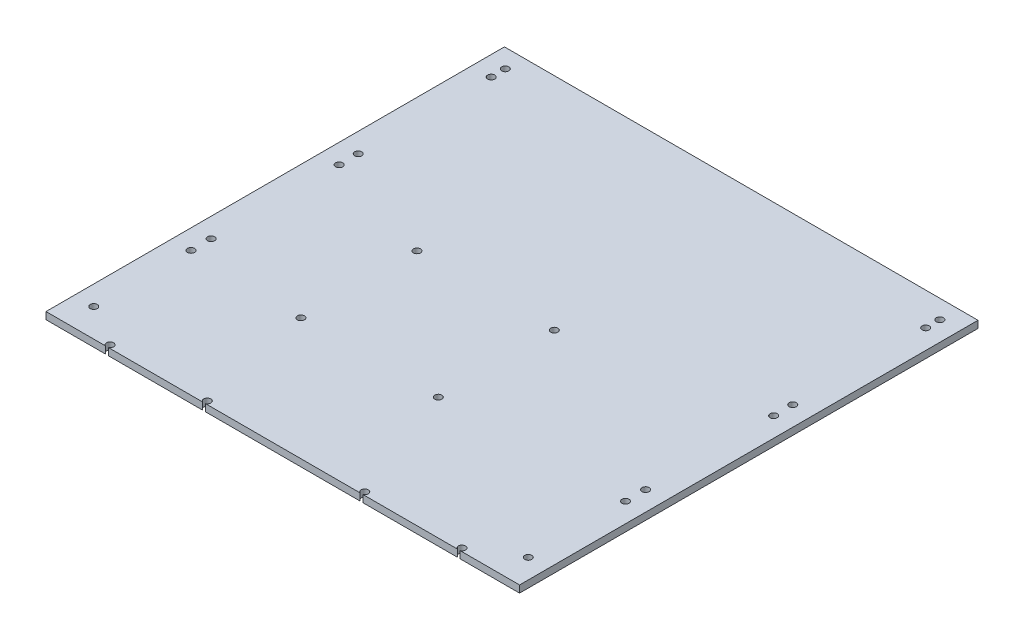
ISO-10303-21;
HEADER;
FILE_DESCRIPTION(('STEP AP214'),'2;1');
FILE_NAME('part.step','',(''),(''),'','','');
FILE_SCHEMA(('AUTOMOTIVE_DESIGN { 1 0 10303 214 1 1 1 1 }'));
ENDSEC;
DATA;
#1=APPLICATION_CONTEXT('core data for automotive mechanical design processes');
#2=APPLICATION_PROTOCOL_DEFINITION('international standard','automotive_design',2000,#1);
#3=PRODUCT_CONTEXT('',#1,'mechanical');
#4=PRODUCT('Part','Part','',(#3));
#5=PRODUCT_RELATED_PRODUCT_CATEGORY('part','',(#4));
#6=PRODUCT_DEFINITION_FORMATION('','',#4);
#7=PRODUCT_DEFINITION_CONTEXT('part definition',#1,'design');
#8=PRODUCT_DEFINITION('design','',#6,#7);
#9=PRODUCT_DEFINITION_SHAPE('','',#8);
#10=(LENGTH_UNIT() NAMED_UNIT(*) SI_UNIT(.MILLI.,.METRE.));
#11=(NAMED_UNIT(*) PLANE_ANGLE_UNIT() SI_UNIT($,.RADIAN.));
#12=(NAMED_UNIT(*) SI_UNIT($,.STERADIAN.) SOLID_ANGLE_UNIT());
#13=UNCERTAINTY_MEASURE_WITH_UNIT(LENGTH_MEASURE(1.E-05),#10,'distance_accuracy_value','');
#14=(GEOMETRIC_REPRESENTATION_CONTEXT(3) GLOBAL_UNCERTAINTY_ASSIGNED_CONTEXT((#13)) GLOBAL_UNIT_ASSIGNED_CONTEXT((#10,
#11,#12)) REPRESENTATION_CONTEXT('',''));
#15=CARTESIAN_POINT('',(0.,0.,0.));
#16=DIRECTION('',(0.,0.,1.));
#17=DIRECTION('',(1.,0.,0.));
#18=AXIS2_PLACEMENT_3D('',#15,#16,#17);
#19=CARTESIAN_POINT('',(100.,0.,123.614911852403));
#20=DIRECTION('',(0.,0.,1.));
#21=DIRECTION('',(1.,0.,0.));
#22=AXIS2_PLACEMENT_3D('',#19,#20,#21);
#23=PLANE('',#22);
#24=DIRECTION('',(0.,1.,0.));
#25=VECTOR('',#24,1.);
#26=CARTESIAN_POINT('',(-32.6272855024608,-2.,123.614911852403));
#27=LINE('',#26,#25);
#28=CARTESIAN_POINT('',(-32.6272855024608,0.,123.614911852403));
#29=VERTEX_POINT('',#28);
#30=CARTESIAN_POINT('',(-32.6272855024608,3.,123.614911852403));
#31=VERTEX_POINT('',#30);
#32=EDGE_CURVE('E174',#29,#31,#27,.T.);
#33=ORIENTED_EDGE('',*,*,#32,.F.);
#34=DIRECTION('',(1.,0.,0.));
#35=VECTOR('',#34,1.);
#36=CARTESIAN_POINT('',(100.,0.,123.614911852403));
#37=LINE('',#36,#35);
#38=CARTESIAN_POINT('',(32.6272855024608,0.,123.614911852403));
#39=VERTEX_POINT('',#38);
#40=EDGE_CURVE('E176',#29,#39,#37,.T.);
#41=ORIENTED_EDGE('',*,*,#40,.T.);
#42=DIRECTION('',(0.,1.,0.));
#43=VECTOR('',#42,1.);
#44=CARTESIAN_POINT('',(32.6272855024608,-2.,123.614911852403));
#45=LINE('',#44,#43);
#46=CARTESIAN_POINT('',(32.6272855024608,3.,123.614911852403));
#47=VERTEX_POINT('',#46);
#48=EDGE_CURVE('E59',#47,#39,#45,.F.);
#49=ORIENTED_EDGE('',*,*,#48,.F.);
#50=DIRECTION('',(1.,0.,0.));
#51=VECTOR('',#50,1.);
#52=CARTESIAN_POINT('',(100.,3.,123.614911852403));
#53=LINE('',#52,#51);
#54=EDGE_CURVE('E153',#31,#47,#53,.T.);
#55=ORIENTED_EDGE('',*,*,#54,.F.);
#56=EDGE_LOOP('',(#33,#41,#49,#55));
#57=FACE_BOUND('',#56,.T.);
#58=ADVANCED_FACE('F36',(#57),#23,.T.);
#59=DIRECTION('',(0.,1.,0.));
#60=VECTOR('',#59,1.);
#61=CARTESIAN_POINT('',(33.8726641996876,-2.,123.614911852403));
#62=LINE('',#61,#60);
#63=CARTESIAN_POINT('',(33.8726641996876,0.,123.614911852403));
#64=VERTEX_POINT('',#63);
#65=CARTESIAN_POINT('',(33.8726641996876,3.,123.614911852403));
#66=VERTEX_POINT('',#65);
#67=EDGE_CURVE('E177',#64,#66,#62,.T.);
#68=ORIENTED_EDGE('',*,*,#67,.F.);
#69=CARTESIAN_POINT('',(73.6852961298601,0.,123.614911852403));
#70=VERTEX_POINT('',#69);
#71=EDGE_CURVE('E164',#64,#70,#37,.T.);
#72=ORIENTED_EDGE('',*,*,#71,.T.);
#73=DIRECTION('',(0.,1.,0.));
#74=VECTOR('',#73,1.);
#75=CARTESIAN_POINT('',(73.6852961298601,-2.,123.614911852403));
#76=LINE('',#75,#74);
#77=CARTESIAN_POINT('',(73.6852961298601,3.,123.614911852403));
#78=VERTEX_POINT('',#77);
#79=EDGE_CURVE('E51',#78,#70,#76,.F.);
#80=ORIENTED_EDGE('',*,*,#79,.F.);
#81=EDGE_CURVE('E142',#66,#78,#53,.T.);
#82=ORIENTED_EDGE('',*,*,#81,.F.);
#83=EDGE_LOOP('',(#68,#72,#80,#82));
#84=FACE_BOUND('',#83,.T.);
#85=ADVANCED_FACE('F215',(#84),#23,.T.);
#86=DIRECTION('',(0.,1.,0.));
#87=VECTOR('',#86,1.);
#88=CARTESIAN_POINT('',(74.9306748270868,-2.,123.614911852403));
#89=LINE('',#88,#87);
#90=CARTESIAN_POINT('',(74.9306748270868,0.,123.614911852403));
#91=VERTEX_POINT('',#90);
#92=CARTESIAN_POINT('',(74.9306748270868,3.,123.614911852403));
#93=VERTEX_POINT('',#92);
#94=EDGE_CURVE('E123',#91,#93,#89,.T.);
#95=ORIENTED_EDGE('',*,*,#94,.F.);
#96=CARTESIAN_POINT('',(100.,0.,123.614911852403));
#97=VERTEX_POINT('',#96);
#98=EDGE_CURVE('E160',#91,#97,#37,.T.);
#99=ORIENTED_EDGE('',*,*,#98,.T.);
#100=DIRECTION('',(0.,1.,0.));
#101=VECTOR('',#100,1.);
#102=CARTESIAN_POINT('',(100.,0.,123.614911852403));
#103=LINE('',#102,#101);
#104=CARTESIAN_POINT('',(100.,3.,123.614911852403));
#105=VERTEX_POINT('',#104);
#106=EDGE_CURVE('E149',#97,#105,#103,.T.);
#107=ORIENTED_EDGE('',*,*,#106,.T.);
#108=EDGE_CURVE('E138',#93,#105,#53,.T.);
#109=ORIENTED_EDGE('',*,*,#108,.F.);
#110=EDGE_LOOP('',(#95,#99,#107,#109));
#111=FACE_BOUND('',#110,.T.);
#112=ADVANCED_FACE('F147',(#111),#23,.T.);
#113=DIRECTION('',(0.,1.,0.));
#114=VECTOR('',#113,1.);
#115=CARTESIAN_POINT('',(-33.8726641996876,-2.,123.614911852403));
#116=LINE('',#115,#114);
#117=CARTESIAN_POINT('',(-33.8726641996876,3.,123.614911852403));
#118=VERTEX_POINT('',#117);
#119=CARTESIAN_POINT('',(-33.8726641996876,0.,123.614911852403));
#120=VERTEX_POINT('',#119);
#121=EDGE_CURVE('E179',#118,#120,#116,.F.);
#122=ORIENTED_EDGE('',*,*,#121,.F.);
#123=CARTESIAN_POINT('',(-73.68529612986,3.,123.614911852403));
#124=VERTEX_POINT('',#123);
#125=EDGE_CURVE('E161',#124,#118,#53,.T.);
#126=ORIENTED_EDGE('',*,*,#125,.F.);
#127=DIRECTION('',(0.,1.,0.));
#128=VECTOR('',#127,1.);
#129=CARTESIAN_POINT('',(-73.68529612986,-2.,123.614911852403));
#130=LINE('',#129,#128);
#131=CARTESIAN_POINT('',(-73.68529612986,0.,123.614911852403));
#132=VERTEX_POINT('',#131);
#133=EDGE_CURVE('E220',#132,#124,#130,.T.);
#134=ORIENTED_EDGE('',*,*,#133,.F.);
#135=EDGE_CURVE('E201',#132,#120,#37,.T.);
#136=ORIENTED_EDGE('',*,*,#135,.T.);
#137=EDGE_LOOP('',(#122,#126,#134,#136));
#138=FACE_BOUND('',#137,.T.);
#139=ADVANCED_FACE('F317',(#138),#23,.T.);
#140=CARTESIAN_POINT('',(100.,3.,-70.));
#141=DIRECTION('',(-1.,0.,0.));
#142=DIRECTION('',(0.,0.,1.));
#143=AXIS2_PLACEMENT_3D('',#140,#141,#142);
#144=PLANE('',#143);
#145=DIRECTION('',(0.,0.,-1.));
#146=VECTOR('',#145,1.);
#147=CARTESIAN_POINT('',(100.,0.,-70.));
#148=LINE('',#147,#146);
#149=CARTESIAN_POINT('',(100.,0.,-70.));
#150=VERTEX_POINT('',#149);
#151=EDGE_CURVE('E239',#97,#150,#148,.T.);
#152=ORIENTED_EDGE('',*,*,#151,.T.);
#153=DIRECTION('',(0.,-1.,0.));
#154=VECTOR('',#153,1.);
#155=CARTESIAN_POINT('',(100.,3.,-70.));
#156=LINE('',#155,#154);
#157=CARTESIAN_POINT('',(100.,3.,-70.));
#158=VERTEX_POINT('',#157);
#159=EDGE_CURVE('E226',#158,#150,#156,.T.);
#160=ORIENTED_EDGE('',*,*,#159,.F.);
#161=DIRECTION('',(0.,0.,-1.));
#162=VECTOR('',#161,1.);
#163=CARTESIAN_POINT('',(100.,3.,-70.));
#164=LINE('',#163,#162);
#165=EDGE_CURVE('E236',#105,#158,#164,.T.);
#166=ORIENTED_EDGE('',*,*,#165,.F.);
#167=ORIENTED_EDGE('',*,*,#106,.F.);
#168=EDGE_LOOP('',(#152,#160,#166,#167));
#169=FACE_BOUND('',#168,.T.);
#170=ADVANCED_FACE('F38',(#169),#144,.F.);
#171=CARTESIAN_POINT('',(-100.,3.,-70.));
#172=DIRECTION('',(0.,0.,1.));
#173=DIRECTION('',(1.,0.,0.));
#174=AXIS2_PLACEMENT_3D('',#171,#172,#173);
#175=PLANE('',#174);
#176=DIRECTION('',(0.,-1.,0.));
#177=VECTOR('',#176,1.);
#178=CARTESIAN_POINT('',(-100.,3.,-70.));
#179=LINE('',#178,#177);
#180=CARTESIAN_POINT('',(-100.,3.,-70.));
#181=VERTEX_POINT('',#180);
#182=CARTESIAN_POINT('',(-100.,0.,-70.));
#183=VERTEX_POINT('',#182);
#184=EDGE_CURVE('E229',#181,#183,#179,.T.);
#185=ORIENTED_EDGE('',*,*,#184,.F.);
#186=DIRECTION('',(-1.,0.,0.));
#187=VECTOR('',#186,1.);
#188=CARTESIAN_POINT('',(-100.,3.,-70.));
#189=LINE('',#188,#187);
#190=EDGE_CURVE('E244',#158,#181,#189,.T.);
#191=ORIENTED_EDGE('',*,*,#190,.F.);
#192=ORIENTED_EDGE('',*,*,#159,.T.);
#193=DIRECTION('',(-1.,0.,0.));
#194=VECTOR('',#193,1.);
#195=CARTESIAN_POINT('',(-100.,0.,-70.));
#196=LINE('',#195,#194);
#197=EDGE_CURVE('E237',#150,#183,#196,.T.);
#198=ORIENTED_EDGE('',*,*,#197,.T.);
#199=EDGE_LOOP('',(#185,#191,#192,#198));
#200=FACE_BOUND('',#199,.T.);
#201=ADVANCED_FACE('F332',(#200),#175,.F.);
#202=CARTESIAN_POINT('',(-100.,3.,-70.));
#203=DIRECTION('',(1.,0.,0.));
#204=DIRECTION('',(0.,0.,-1.));
#205=AXIS2_PLACEMENT_3D('',#202,#203,#204);
#206=PLANE('',#205);
#207=DIRECTION('',(0.,0.,1.));
#208=VECTOR('',#207,1.);
#209=CARTESIAN_POINT('',(-100.,0.,-70.));
#210=LINE('',#209,#208);
#211=CARTESIAN_POINT('',(-100.,0.,123.614911852403));
#212=VERTEX_POINT('',#211);
#213=EDGE_CURVE('E233',#183,#212,#210,.T.);
#214=ORIENTED_EDGE('',*,*,#213,.T.);
#215=DIRECTION('',(0.,1.,0.));
#216=VECTOR('',#215,1.);
#217=CARTESIAN_POINT('',(-100.,0.,123.614911852403));
#218=LINE('',#217,#216);
#219=CARTESIAN_POINT('',(-100.,3.,123.614911852403));
#220=VERTEX_POINT('',#219);
#221=EDGE_CURVE('E150',#212,#220,#218,.T.);
#222=ORIENTED_EDGE('',*,*,#221,.T.);
#223=DIRECTION('',(0.,0.,1.));
#224=VECTOR('',#223,1.);
#225=CARTESIAN_POINT('',(-100.,3.,-70.));
#226=LINE('',#225,#224);
#227=EDGE_CURVE('E232',#181,#220,#226,.T.);
#228=ORIENTED_EDGE('',*,*,#227,.F.);
#229=ORIENTED_EDGE('',*,*,#184,.T.);
#230=EDGE_LOOP('',(#214,#222,#228,#229));
#231=FACE_BOUND('',#230,.T.);
#232=ADVANCED_FACE('F342',(#231),#206,.F.);
#233=CARTESIAN_POINT('',(0.,3.,0.));
#234=DIRECTION('',(0.,1.,0.));
#235=DIRECTION('',(0.,0.,1.));
#236=AXIS2_PLACEMENT_3D('',#233,#234,#235);
#237=PLANE('',#236);
#238=CARTESIAN_POINT('',(-91.7562201617976,3.,8.06038911279249));
#239=DIRECTION('',(0.,1.,0.));
#240=DIRECTION('',(0.,0.,1.));
#241=AXIS2_PLACEMENT_3D('',#238,#239,#240);
#242=CIRCLE('',#241,1.5);
#243=CARTESIAN_POINT('',(-91.7562201617976,3.,9.56038911279249));
#244=VERTEX_POINT('',#243);
#245=EDGE_CURVE('E611',#244,#244,#242,.T.);
#246=ORIENTED_EDGE('',*,*,#245,.F.);
#247=EDGE_LOOP('',(#246));
#248=FACE_BOUND('',#247,.T.);
#249=CARTESIAN_POINT('',(-91.7562201617975,3.,-56.1634380471855));
#250=DIRECTION('',(0.,1.,0.));
#251=DIRECTION('',(0.,0.,1.));
#252=AXIS2_PLACEMENT_3D('',#249,#250,#251);
#253=CIRCLE('',#252,1.5);
#254=CARTESIAN_POINT('',(-91.7562201617975,3.,-54.6634380471855));
#255=VERTEX_POINT('',#254);
#256=EDGE_CURVE('E617',#255,#255,#253,.T.);
#257=ORIENTED_EDGE('',*,*,#256,.F.);
#258=EDGE_LOOP('',(#257));
#259=FACE_BOUND('',#258,.T.);
#260=CARTESIAN_POINT('',(91.7562201617975,3.,-56.1634380471857));
#261=DIRECTION('',(0.,1.,0.));
#262=DIRECTION('',(0.,0.,-1.));
#263=AXIS2_PLACEMENT_3D('',#260,#261,#262);
#264=CIRCLE('',#263,1.5);
#265=CARTESIAN_POINT('',(91.7562201617975,3.,-57.6634380471857));
#266=VERTEX_POINT('',#265);
#267=EDGE_CURVE('E625',#266,#266,#264,.T.);
#268=ORIENTED_EDGE('',*,*,#267,.F.);
#269=EDGE_LOOP('',(#268));
#270=FACE_BOUND('',#269,.T.);
#271=CARTESIAN_POINT('',(91.7562201617977,3.,8.06038911279227));
#272=DIRECTION('',(0.,1.,0.));
#273=DIRECTION('',(0.,0.,-1.));
#274=AXIS2_PLACEMENT_3D('',#271,#272,#273);
#275=CIRCLE('',#274,1.5);
#276=CARTESIAN_POINT('',(91.7562201617977,3.,6.56038911279227));
#277=VERTEX_POINT('',#276);
#278=EDGE_CURVE('E631',#277,#277,#275,.T.);
#279=ORIENTED_EDGE('',*,*,#278,.F.);
#280=EDGE_LOOP('',(#279));
#281=FACE_BOUND('',#280,.T.);
#282=CARTESIAN_POINT('',(91.7562201617978,3.,70.6251903858705));
#283=DIRECTION('',(0.,1.,0.));
#284=DIRECTION('',(0.,0.,-1.));
#285=AXIS2_PLACEMENT_3D('',#282,#283,#284);
#286=CIRCLE('',#285,1.49999999999998);
#287=CARTESIAN_POINT('',(91.7562201617978,3.,69.1251903858705));
#288=VERTEX_POINT('',#287);
#289=EDGE_CURVE('E637',#288,#288,#286,.T.);
#290=ORIENTED_EDGE('',*,*,#289,.F.);
#291=EDGE_LOOP('',(#290));
#292=FACE_BOUND('',#291,.T.);
#293=CARTESIAN_POINT('',(-91.7562201617976,3.,70.6251903858708));
#294=DIRECTION('',(0.,1.,0.));
#295=DIRECTION('',(0.,0.,1.));
#296=AXIS2_PLACEMENT_3D('',#293,#294,#295);
#297=CIRCLE('',#296,1.49999999999998);
#298=CARTESIAN_POINT('',(-91.7562201617976,3.,72.1251903858708));
#299=VERTEX_POINT('',#298);
#300=EDGE_CURVE('E614',#299,#299,#297,.T.);
#301=ORIENTED_EDGE('',*,*,#300,.F.);
#302=EDGE_LOOP('',(#301));
#303=FACE_BOUND('',#302,.T.);
#304=CARTESIAN_POINT('',(-43.8555498234348,3.,23.0834680732812));
#305=DIRECTION('',(0.,1.,0.));
#306=DIRECTION('',(0.,0.,1.));
#307=AXIS2_PLACEMENT_3D('',#304,#305,#306);
#308=CIRCLE('',#307,1.5);
#309=CARTESIAN_POINT('',(-43.8555498234348,3.,24.5834680732812));
#310=VERTEX_POINT('',#309);
#311=EDGE_CURVE('E650',#310,#310,#308,.T.);
#312=ORIENTED_EDGE('',*,*,#311,.F.);
#313=EDGE_LOOP('',(#312));
#314=FACE_BOUND('',#313,.T.);
#315=CARTESIAN_POINT('',(-43.8555498234348,3.,72.0834680732812));
#316=DIRECTION('',(0.,1.,0.));
#317=DIRECTION('',(0.,0.,1.));
#318=AXIS2_PLACEMENT_3D('',#315,#316,#317);
#319=CIRCLE('',#318,1.5);
#320=CARTESIAN_POINT('',(-43.8555498234348,3.,73.5834680732812));
#321=VERTEX_POINT('',#320);
#322=EDGE_CURVE('E656',#321,#321,#319,.T.);
#323=ORIENTED_EDGE('',*,*,#322,.F.);
#324=EDGE_LOOP('',(#323));
#325=FACE_BOUND('',#324,.T.);
#326=CARTESIAN_POINT('',(14.1444501765652,3.,72.0834680732812));
#327=DIRECTION('',(0.,1.,0.));
#328=DIRECTION('',(0.,0.,1.));
#329=AXIS2_PLACEMENT_3D('',#326,#327,#328);
#330=CIRCLE('',#329,1.5);
#331=CARTESIAN_POINT('',(14.1444501765652,3.,73.5834680732812));
#332=VERTEX_POINT('',#331);
#333=EDGE_CURVE('E643',#332,#332,#330,.T.);
#334=ORIENTED_EDGE('',*,*,#333,.F.);
#335=EDGE_LOOP('',(#334));
#336=FACE_BOUND('',#335,.T.);
#337=CARTESIAN_POINT('',(14.1444501765652,3.,23.0834680732812));
#338=DIRECTION('',(0.,1.,0.));
#339=DIRECTION('',(0.,0.,1.));
#340=AXIS2_PLACEMENT_3D('',#337,#338,#339);
#341=CIRCLE('',#340,1.5);
#342=CARTESIAN_POINT('',(14.1444501765652,3.,24.5834680732812));
#343=VERTEX_POINT('',#342);
#344=EDGE_CURVE('E649',#343,#343,#341,.T.);
#345=ORIENTED_EDGE('',*,*,#344,.F.);
#346=EDGE_LOOP('',(#345));
#347=FACE_BOUND('',#346,.T.);
#348=CARTESIAN_POINT('',(-33.2499748510742,3.,122.250266119942));
#349=DIRECTION('',(0.,1.,0.));
#350=DIRECTION('',(0.,0.,1.));
#351=AXIS2_PLACEMENT_3D('',#348,#349,#350);
#352=CIRCLE('',#351,1.5);
#353=EDGE_CURVE('E170',#31,#118,#352,.T.);
#354=ORIENTED_EDGE('',*,*,#353,.F.);
#355=ORIENTED_EDGE('',*,*,#54,.T.);
#356=CARTESIAN_POINT('',(33.2499748510742,3.,122.250266119942));
#357=DIRECTION('',(0.,1.,0.));
#358=DIRECTION('',(0.,0.,1.));
#359=AXIS2_PLACEMENT_3D('',#356,#357,#358);
#360=CIRCLE('',#359,1.5);
#361=EDGE_CURVE('E143',#66,#47,#360,.T.);
#362=ORIENTED_EDGE('',*,*,#361,.F.);
#363=ORIENTED_EDGE('',*,*,#81,.T.);
#364=CARTESIAN_POINT('',(74.3079854784735,3.,122.250266119942));
#365=DIRECTION('',(0.,1.,0.));
#366=DIRECTION('',(0.,0.,1.));
#367=AXIS2_PLACEMENT_3D('',#364,#365,#366);
#368=CIRCLE('',#367,1.5);
#369=EDGE_CURVE('E126',#93,#78,#368,.T.);
#370=ORIENTED_EDGE('',*,*,#369,.F.);
#371=ORIENTED_EDGE('',*,*,#108,.T.);
#372=ORIENTED_EDGE('',*,*,#165,.T.);
#373=ORIENTED_EDGE('',*,*,#190,.T.);
#374=ORIENTED_EDGE('',*,*,#227,.T.);
#375=CARTESIAN_POINT('',(-74.9306748270869,3.,123.614911852403));
#376=VERTEX_POINT('',#375);
#377=EDGE_CURVE('E152',#220,#376,#53,.T.);
#378=ORIENTED_EDGE('',*,*,#377,.T.);
#379=CARTESIAN_POINT('',(-74.3079854784735,3.,122.250266119942));
#380=DIRECTION('',(0.,1.,0.));
#381=DIRECTION('',(0.,0.,1.));
#382=AXIS2_PLACEMENT_3D('',#379,#380,#381);
#383=CIRCLE('',#382,1.50000000000001);
#384=EDGE_CURVE('E185',#124,#376,#383,.T.);
#385=ORIENTED_EDGE('',*,*,#384,.F.);
#386=ORIENTED_EDGE('',*,*,#125,.T.);
#387=EDGE_LOOP('',(#354,#355,#362,#363,#370,#371,#372,#373,#374,#378,#385,#386));
#388=FACE_BOUND('',#387,.T.);
#389=CARTESIAN_POINT('',(91.7562201617976,3.,111.691638534937));
#390=DIRECTION('',(0.,1.,0.));
#391=DIRECTION('',(0.,0.,-1.));
#392=AXIS2_PLACEMENT_3D('',#389,#390,#391);
#393=CIRCLE('',#392,1.5);
#394=CARTESIAN_POINT('',(91.7562201617976,3.,110.191638534937));
#395=VERTEX_POINT('',#394);
#396=EDGE_CURVE('E190',#395,#395,#393,.T.);
#397=ORIENTED_EDGE('',*,*,#396,.F.);
#398=EDGE_LOOP('',(#397));
#399=FACE_BOUND('',#398,.T.);
#400=CARTESIAN_POINT('',(-91.7562201617976,3.,111.691638534937));
#401=DIRECTION('',(0.,1.,0.));
#402=DIRECTION('',(0.,0.,1.));
#403=AXIS2_PLACEMENT_3D('',#400,#401,#402);
#404=CIRCLE('',#403,1.5);
#405=CARTESIAN_POINT('',(-91.7562201617976,3.,113.191638534937));
#406=VERTEX_POINT('',#405);
#407=EDGE_CURVE('E194',#406,#406,#404,.T.);
#408=ORIENTED_EDGE('',*,*,#407,.F.);
#409=EDGE_LOOP('',(#408));
#410=FACE_BOUND('',#409,.T.);
#411=CARTESIAN_POINT('',(-91.7562201617975,3.,0.));
#412=DIRECTION('',(0.,1.,0.));
#413=DIRECTION('',(0.,0.,1.));
#414=AXIS2_PLACEMENT_3D('',#411,#412,#413);
#415=CIRCLE('',#414,1.5);
#416=CARTESIAN_POINT('',(-91.7562201617975,3.,1.50000000000003));
#417=VERTEX_POINT('',#416);
#418=EDGE_CURVE('E242',#417,#417,#415,.T.);
#419=ORIENTED_EDGE('',*,*,#418,.F.);
#420=EDGE_LOOP('',(#419));
#421=FACE_BOUND('',#420,.T.);
#422=CARTESIAN_POINT('',(91.7562201617976,3.,0.));
#423=DIRECTION('',(0.,1.,0.));
#424=DIRECTION('',(0.,0.,1.));
#425=AXIS2_PLACEMENT_3D('',#422,#423,#424);
#426=CIRCLE('',#425,1.5);
#427=CARTESIAN_POINT('',(91.7562201617976,3.,1.5));
#428=VERTEX_POINT('',#427);
#429=EDGE_CURVE('E249',#428,#428,#426,.T.);
#430=ORIENTED_EDGE('',*,*,#429,.F.);
#431=EDGE_LOOP('',(#430));
#432=FACE_BOUND('',#431,.T.);
#433=CARTESIAN_POINT('',(-91.7562201617975,3.,62.1301438169568));
#434=DIRECTION('',(0.,1.,0.));
#435=DIRECTION('',(0.,0.,1.));
#436=AXIS2_PLACEMENT_3D('',#433,#434,#435);
#437=CIRCLE('',#436,1.5);
#438=CARTESIAN_POINT('',(-91.7562201617975,3.,63.6301438169568));
#439=VERTEX_POINT('',#438);
#440=EDGE_CURVE('E252',#439,#439,#437,.T.);
#441=ORIENTED_EDGE('',*,*,#440,.F.);
#442=EDGE_LOOP('',(#441));
#443=FACE_BOUND('',#442,.T.);
#444=CARTESIAN_POINT('',(91.7562201617976,3.,-62.1301438169568));
#445=DIRECTION('',(0.,1.,0.));
#446=DIRECTION('',(0.,0.,1.));
#447=AXIS2_PLACEMENT_3D('',#444,#445,#446);
#448=CIRCLE('',#447,1.5);
#449=CARTESIAN_POINT('',(91.7562201617976,3.,-60.6301438169568));
#450=VERTEX_POINT('',#449);
#451=EDGE_CURVE('E255',#450,#450,#448,.T.);
#452=ORIENTED_EDGE('',*,*,#451,.F.);
#453=EDGE_LOOP('',(#452));
#454=FACE_BOUND('',#453,.T.);
#455=CARTESIAN_POINT('',(-91.7562201617976,3.,-62.1301438169568));
#456=DIRECTION('',(0.,1.,0.));
#457=DIRECTION('',(0.,0.,1.));
#458=AXIS2_PLACEMENT_3D('',#455,#456,#457);
#459=CIRCLE('',#458,1.5);
#460=CARTESIAN_POINT('',(-91.7562201617976,3.,-60.6301438169568));
#461=VERTEX_POINT('',#460);
#462=EDGE_CURVE('E258',#461,#461,#459,.T.);
#463=ORIENTED_EDGE('',*,*,#462,.F.);
#464=EDGE_LOOP('',(#463));
#465=FACE_BOUND('',#464,.T.);
#466=CARTESIAN_POINT('',(91.7562201617976,3.,62.1301438169568));
#467=DIRECTION('',(0.,1.,0.));
#468=DIRECTION('',(0.,0.,1.));
#469=AXIS2_PLACEMENT_3D('',#466,#467,#468);
#470=CIRCLE('',#469,1.5);
#471=CARTESIAN_POINT('',(91.7562201617976,3.,63.6301438169568));
#472=VERTEX_POINT('',#471);
#473=EDGE_CURVE('E261',#472,#472,#470,.T.);
#474=ORIENTED_EDGE('',*,*,#473,.F.);
#475=EDGE_LOOP('',(#474));
#476=FACE_BOUND('',#475,.T.);
#477=ADVANCED_FACE('F135',(#248,#259,#270,#281,#292,#303,#314,#325,#336,#347,#388,#399,#410,
#421,#432,#443,#454,#465,#476),#237,.T.);
#478=CARTESIAN_POINT('',(0.,0.,0.));
#479=DIRECTION('',(0.,1.,0.));
#480=DIRECTION('',(0.,0.,1.));
#481=AXIS2_PLACEMENT_3D('',#478,#479,#480);
#482=PLANE('',#481);
#483=CARTESIAN_POINT('',(-91.7562201617976,0.,8.06038911279249));
#484=DIRECTION('',(0.,1.,0.));
#485=DIRECTION('',(0.,0.,1.));
#486=AXIS2_PLACEMENT_3D('',#483,#484,#485);
#487=CIRCLE('',#486,1.5);
#488=CARTESIAN_POINT('',(-91.7562201617976,0.,9.56038911279249));
#489=VERTEX_POINT('',#488);
#490=EDGE_CURVE('E608',#489,#489,#487,.T.);
#491=ORIENTED_EDGE('',*,*,#490,.T.);
#492=EDGE_LOOP('',(#491));
#493=FACE_BOUND('',#492,.T.);
#494=CARTESIAN_POINT('',(-91.7562201617975,0.,-56.1634380471855));
#495=DIRECTION('',(0.,1.,0.));
#496=DIRECTION('',(0.,0.,1.));
#497=AXIS2_PLACEMENT_3D('',#494,#495,#496);
#498=CIRCLE('',#497,1.5);
#499=CARTESIAN_POINT('',(-91.7562201617975,0.,-54.6634380471855));
#500=VERTEX_POINT('',#499);
#501=EDGE_CURVE('E612',#500,#500,#498,.T.);
#502=ORIENTED_EDGE('',*,*,#501,.T.);
#503=EDGE_LOOP('',(#502));
#504=FACE_BOUND('',#503,.T.);
#505=CARTESIAN_POINT('',(91.7562201617975,0.,-56.1634380471857));
#506=DIRECTION('',(0.,1.,0.));
#507=DIRECTION('',(0.,0.,-1.));
#508=AXIS2_PLACEMENT_3D('',#505,#506,#507);
#509=CIRCLE('',#508,1.5);
#510=CARTESIAN_POINT('',(91.7562201617975,0.,-57.6634380471857));
#511=VERTEX_POINT('',#510);
#512=EDGE_CURVE('E622',#511,#511,#509,.T.);
#513=ORIENTED_EDGE('',*,*,#512,.T.);
#514=EDGE_LOOP('',(#513));
#515=FACE_BOUND('',#514,.T.);
#516=CARTESIAN_POINT('',(91.7562201617977,0.,8.06038911279227));
#517=DIRECTION('',(0.,1.,0.));
#518=DIRECTION('',(0.,0.,-1.));
#519=AXIS2_PLACEMENT_3D('',#516,#517,#518);
#520=CIRCLE('',#519,1.5);
#521=CARTESIAN_POINT('',(91.7562201617977,0.,6.56038911279227));
#522=VERTEX_POINT('',#521);
#523=EDGE_CURVE('E628',#522,#522,#520,.T.);
#524=ORIENTED_EDGE('',*,*,#523,.T.);
#525=EDGE_LOOP('',(#524));
#526=FACE_BOUND('',#525,.T.);
#527=CARTESIAN_POINT('',(91.7562201617978,0.,70.6251903858705));
#528=DIRECTION('',(0.,1.,0.));
#529=DIRECTION('',(0.,0.,-1.));
#530=AXIS2_PLACEMENT_3D('',#527,#528,#529);
#531=CIRCLE('',#530,1.49999999999998);
#532=CARTESIAN_POINT('',(91.7562201617978,0.,69.1251903858705));
#533=VERTEX_POINT('',#532);
#534=EDGE_CURVE('E634',#533,#533,#531,.T.);
#535=ORIENTED_EDGE('',*,*,#534,.T.);
#536=EDGE_LOOP('',(#535));
#537=FACE_BOUND('',#536,.T.);
#538=CARTESIAN_POINT('',(-91.7562201617976,0.,70.6251903858708));
#539=DIRECTION('',(0.,1.,0.));
#540=DIRECTION('',(0.,0.,1.));
#541=AXIS2_PLACEMENT_3D('',#538,#539,#540);
#542=CIRCLE('',#541,1.49999999999998);
#543=CARTESIAN_POINT('',(-91.7562201617976,0.,72.1251903858708));
#544=VERTEX_POINT('',#543);
#545=EDGE_CURVE('E640',#544,#544,#542,.T.);
#546=ORIENTED_EDGE('',*,*,#545,.T.);
#547=EDGE_LOOP('',(#546));
#548=FACE_BOUND('',#547,.T.);
#549=CARTESIAN_POINT('',(-43.8555498234348,0.,23.0834680732812));
#550=DIRECTION('',(0.,1.,0.));
#551=DIRECTION('',(0.,0.,1.));
#552=AXIS2_PLACEMENT_3D('',#549,#550,#551);
#553=CIRCLE('',#552,1.5);
#554=CARTESIAN_POINT('',(-43.8555498234348,0.,24.5834680732812));
#555=VERTEX_POINT('',#554);
#556=EDGE_CURVE('E646',#555,#555,#553,.T.);
#557=ORIENTED_EDGE('',*,*,#556,.T.);
#558=EDGE_LOOP('',(#557));
#559=FACE_BOUND('',#558,.T.);
#560=CARTESIAN_POINT('',(-43.8555498234348,0.,72.0834680732812));
#561=DIRECTION('',(0.,1.,0.));
#562=DIRECTION('',(0.,0.,1.));
#563=AXIS2_PLACEMENT_3D('',#560,#561,#562);
#564=CIRCLE('',#563,1.5);
#565=CARTESIAN_POINT('',(-43.8555498234348,0.,73.5834680732812));
#566=VERTEX_POINT('',#565);
#567=EDGE_CURVE('E653',#566,#566,#564,.T.);
#568=ORIENTED_EDGE('',*,*,#567,.T.);
#569=EDGE_LOOP('',(#568));
#570=FACE_BOUND('',#569,.T.);
#571=CARTESIAN_POINT('',(14.1444501765652,0.,72.0834680732812));
#572=DIRECTION('',(0.,1.,0.));
#573=DIRECTION('',(0.,0.,1.));
#574=AXIS2_PLACEMENT_3D('',#571,#572,#573);
#575=CIRCLE('',#574,1.5);
#576=CARTESIAN_POINT('',(14.1444501765652,0.,73.5834680732812));
#577=VERTEX_POINT('',#576);
#578=EDGE_CURVE('E659',#577,#577,#575,.T.);
#579=ORIENTED_EDGE('',*,*,#578,.T.);
#580=EDGE_LOOP('',(#579));
#581=FACE_BOUND('',#580,.T.);
#582=CARTESIAN_POINT('',(14.1444501765652,0.,23.0834680732812));
#583=DIRECTION('',(0.,1.,0.));
#584=DIRECTION('',(0.,0.,1.));
#585=AXIS2_PLACEMENT_3D('',#582,#583,#584);
#586=CIRCLE('',#585,1.5);
#587=CARTESIAN_POINT('',(14.1444501765652,0.,24.5834680732812));
#588=VERTEX_POINT('',#587);
#589=EDGE_CURVE('E144',#588,#588,#586,.T.);
#590=ORIENTED_EDGE('',*,*,#589,.T.);
#591=EDGE_LOOP('',(#590));
#592=FACE_BOUND('',#591,.T.);
#593=ORIENTED_EDGE('',*,*,#40,.F.);
#594=CARTESIAN_POINT('',(-33.2499748510742,0.,122.250266119942));
#595=DIRECTION('',(0.,1.,0.));
#596=DIRECTION('',(0.,0.,1.));
#597=AXIS2_PLACEMENT_3D('',#594,#595,#596);
#598=CIRCLE('',#597,1.5);
#599=EDGE_CURVE('E11',#29,#120,#598,.T.);
#600=ORIENTED_EDGE('',*,*,#599,.T.);
#601=ORIENTED_EDGE('',*,*,#135,.F.);
#602=CARTESIAN_POINT('',(-74.3079854784735,0.,122.250266119942));
#603=DIRECTION('',(0.,1.,0.));
#604=DIRECTION('',(0.,0.,1.));
#605=AXIS2_PLACEMENT_3D('',#602,#603,#604);
#606=CIRCLE('',#605,1.50000000000001);
#607=CARTESIAN_POINT('',(-74.9306748270869,0.,123.614911852403));
#608=VERTEX_POINT('',#607);
#609=EDGE_CURVE('E187',#132,#608,#606,.T.);
#610=ORIENTED_EDGE('',*,*,#609,.T.);
#611=EDGE_CURVE('E165',#212,#608,#37,.T.);
#612=ORIENTED_EDGE('',*,*,#611,.F.);
#613=ORIENTED_EDGE('',*,*,#213,.F.);
#614=ORIENTED_EDGE('',*,*,#197,.F.);
#615=ORIENTED_EDGE('',*,*,#151,.F.);
#616=ORIENTED_EDGE('',*,*,#98,.F.);
#617=CARTESIAN_POINT('',(74.3079854784735,0.,122.250266119942));
#618=DIRECTION('',(0.,1.,0.));
#619=DIRECTION('',(0.,0.,1.));
#620=AXIS2_PLACEMENT_3D('',#617,#618,#619);
#621=CIRCLE('',#620,1.5);
#622=EDGE_CURVE('E127',#91,#70,#621,.T.);
#623=ORIENTED_EDGE('',*,*,#622,.T.);
#624=ORIENTED_EDGE('',*,*,#71,.F.);
#625=CARTESIAN_POINT('',(33.2499748510742,0.,122.250266119942));
#626=DIRECTION('',(0.,1.,0.));
#627=DIRECTION('',(0.,0.,1.));
#628=AXIS2_PLACEMENT_3D('',#625,#626,#627);
#629=CIRCLE('',#628,1.5);
#630=EDGE_CURVE('E44',#64,#39,#629,.T.);
#631=ORIENTED_EDGE('',*,*,#630,.T.);
#632=EDGE_LOOP('',(#593,#600,#601,#610,#612,#613,#614,#615,#616,#623,#624,#631));
#633=FACE_BOUND('',#632,.T.);
#634=CARTESIAN_POINT('',(91.7562201617976,0.,111.691638534937));
#635=DIRECTION('',(0.,1.,0.));
#636=DIRECTION('',(0.,0.,-1.));
#637=AXIS2_PLACEMENT_3D('',#634,#635,#636);
#638=CIRCLE('',#637,1.5);
#639=CARTESIAN_POINT('',(91.7562201617976,0.,110.191638534937));
#640=VERTEX_POINT('',#639);
#641=EDGE_CURVE('E191',#640,#640,#638,.T.);
#642=ORIENTED_EDGE('',*,*,#641,.T.);
#643=EDGE_LOOP('',(#642));
#644=FACE_BOUND('',#643,.T.);
#645=CARTESIAN_POINT('',(-91.7562201617976,0.,111.691638534937));
#646=DIRECTION('',(0.,1.,0.));
#647=DIRECTION('',(0.,0.,1.));
#648=AXIS2_PLACEMENT_3D('',#645,#646,#647);
#649=CIRCLE('',#648,1.5);
#650=CARTESIAN_POINT('',(-91.7562201617976,0.,113.191638534937));
#651=VERTEX_POINT('',#650);
#652=EDGE_CURVE('E155',#651,#651,#649,.T.);
#653=ORIENTED_EDGE('',*,*,#652,.T.);
#654=EDGE_LOOP('',(#653));
#655=FACE_BOUND('',#654,.T.);
#656=CARTESIAN_POINT('',(-91.7562201617975,0.,0.));
#657=DIRECTION('',(0.,-1.,0.));
#658=DIRECTION('',(0.,0.,-1.));
#659=AXIS2_PLACEMENT_3D('',#656,#657,#658);
#660=CIRCLE('',#659,1.5);
#661=CARTESIAN_POINT('',(-91.7562201617975,0.,-1.49999999999997));
#662=VERTEX_POINT('',#661);
#663=EDGE_CURVE('E205',#662,#662,#660,.T.);
#664=ORIENTED_EDGE('',*,*,#663,.F.);
#665=EDGE_LOOP('',(#664));
#666=FACE_BOUND('',#665,.T.);
#667=CARTESIAN_POINT('',(91.7562201617976,0.,0.));
#668=DIRECTION('',(0.,-1.,0.));
#669=DIRECTION('',(0.,0.,1.));
#670=AXIS2_PLACEMENT_3D('',#667,#668,#669);
#671=CIRCLE('',#670,1.5);
#672=CARTESIAN_POINT('',(91.7562201617976,0.,1.5));
#673=VERTEX_POINT('',#672);
#674=EDGE_CURVE('E276',#673,#673,#671,.T.);
#675=ORIENTED_EDGE('',*,*,#674,.F.);
#676=EDGE_LOOP('',(#675));
#677=FACE_BOUND('',#676,.T.);
#678=CARTESIAN_POINT('',(-91.7562201617975,0.,62.1301438169568));
#679=DIRECTION('',(0.,-1.,0.));
#680=DIRECTION('',(0.,0.,-1.));
#681=AXIS2_PLACEMENT_3D('',#678,#679,#680);
#682=CIRCLE('',#681,1.5);
#683=CARTESIAN_POINT('',(-91.7562201617975,0.,60.6301438169568));
#684=VERTEX_POINT('',#683);
#685=EDGE_CURVE('E271',#684,#684,#682,.T.);
#686=ORIENTED_EDGE('',*,*,#685,.F.);
#687=EDGE_LOOP('',(#686));
#688=FACE_BOUND('',#687,.T.);
#689=CARTESIAN_POINT('',(91.7562201617976,0.,-62.1301438169568));
#690=DIRECTION('',(0.,-1.,0.));
#691=DIRECTION('',(0.,0.,-1.));
#692=AXIS2_PLACEMENT_3D('',#689,#690,#691);
#693=CIRCLE('',#692,1.5);
#694=CARTESIAN_POINT('',(91.7562201617976,0.,-63.6301438169568));
#695=VERTEX_POINT('',#694);
#696=EDGE_CURVE('E264',#695,#695,#693,.T.);
#697=ORIENTED_EDGE('',*,*,#696,.F.);
#698=EDGE_LOOP('',(#697));
#699=FACE_BOUND('',#698,.T.);
#700=CARTESIAN_POINT('',(-91.7562201617976,0.,-62.1301438169568));
#701=DIRECTION('',(0.,-1.,0.));
#702=DIRECTION('',(0.,0.,1.));
#703=AXIS2_PLACEMENT_3D('',#700,#701,#702);
#704=CIRCLE('',#703,1.5);
#705=CARTESIAN_POINT('',(-91.7562201617976,0.,-60.6301438169568));
#706=VERTEX_POINT('',#705);
#707=EDGE_CURVE('E267',#706,#706,#704,.T.);
#708=ORIENTED_EDGE('',*,*,#707,.F.);
#709=EDGE_LOOP('',(#708));
#710=FACE_BOUND('',#709,.T.);
#711=CARTESIAN_POINT('',(91.7562201617976,0.,62.1301438169568));
#712=DIRECTION('',(0.,-1.,0.));
#713=DIRECTION('',(0.,0.,1.));
#714=AXIS2_PLACEMENT_3D('',#711,#712,#713);
#715=CIRCLE('',#714,1.5);
#716=CARTESIAN_POINT('',(91.7562201617976,0.,63.6301438169568));
#717=VERTEX_POINT('',#716);
#718=EDGE_CURVE('E268',#717,#717,#715,.T.);
#719=ORIENTED_EDGE('',*,*,#718,.F.);
#720=EDGE_LOOP('',(#719));
#721=FACE_BOUND('',#720,.T.);
#722=ADVANCED_FACE('F217',(#493,#504,#515,#526,#537,#548,#559,#570,#581,#592,#633,#644,#655,
#666,#677,#688,#699,#710,#721),#482,.F.);
#723=CARTESIAN_POINT('',(91.7562201617976,6.,62.1301438169568));
#724=DIRECTION('',(0.,-1.,0.));
#725=DIRECTION('',(0.,0.,-1.));
#726=AXIS2_PLACEMENT_3D('',#723,#724,#725);
#727=CYLINDRICAL_SURFACE('',#726,1.5);
#728=ORIENTED_EDGE('',*,*,#473,.T.);
#729=EDGE_LOOP('',(#728));
#730=FACE_BOUND('',#729,.T.);
#731=ORIENTED_EDGE('',*,*,#718,.T.);
#732=EDGE_LOOP('',(#731));
#733=FACE_BOUND('',#732,.T.);
#734=ADVANCED_FACE('F286',(#730,#733),#727,.F.);
#735=CARTESIAN_POINT('',(-91.7562201617976,6.,-62.1301438169568));
#736=DIRECTION('',(0.,-1.,0.));
#737=DIRECTION('',(0.,0.,-1.));
#738=AXIS2_PLACEMENT_3D('',#735,#736,#737);
#739=CYLINDRICAL_SURFACE('',#738,1.5);
#740=ORIENTED_EDGE('',*,*,#462,.T.);
#741=EDGE_LOOP('',(#740));
#742=FACE_BOUND('',#741,.T.);
#743=ORIENTED_EDGE('',*,*,#707,.T.);
#744=EDGE_LOOP('',(#743));
#745=FACE_BOUND('',#744,.T.);
#746=ADVANCED_FACE('F296',(#742,#745),#739,.F.);
#747=CARTESIAN_POINT('',(91.7562201617976,6.,-62.1301438169568));
#748=DIRECTION('',(0.,-1.,0.));
#749=DIRECTION('',(0.,0.,-1.));
#750=AXIS2_PLACEMENT_3D('',#747,#748,#749);
#751=CYLINDRICAL_SURFACE('',#750,1.5);
#752=ORIENTED_EDGE('',*,*,#451,.T.);
#753=EDGE_LOOP('',(#752));
#754=FACE_BOUND('',#753,.T.);
#755=ORIENTED_EDGE('',*,*,#696,.T.);
#756=EDGE_LOOP('',(#755));
#757=FACE_BOUND('',#756,.T.);
#758=ADVANCED_FACE('F302',(#754,#757),#751,.F.);
#759=CARTESIAN_POINT('',(-91.7562201617975,6.,62.1301438169568));
#760=DIRECTION('',(0.,-1.,0.));
#761=DIRECTION('',(0.,0.,-1.));
#762=AXIS2_PLACEMENT_3D('',#759,#760,#761);
#763=CYLINDRICAL_SURFACE('',#762,1.5);
#764=ORIENTED_EDGE('',*,*,#440,.T.);
#765=EDGE_LOOP('',(#764));
#766=FACE_BOUND('',#765,.T.);
#767=ORIENTED_EDGE('',*,*,#685,.T.);
#768=EDGE_LOOP('',(#767));
#769=FACE_BOUND('',#768,.T.);
#770=ADVANCED_FACE('F282',(#766,#769),#763,.F.);
#771=CARTESIAN_POINT('',(91.7562201617976,6.,0.));
#772=DIRECTION('',(0.,-1.,0.));
#773=DIRECTION('',(0.,0.,-1.));
#774=AXIS2_PLACEMENT_3D('',#771,#772,#773);
#775=CYLINDRICAL_SURFACE('',#774,1.5);
#776=ORIENTED_EDGE('',*,*,#429,.T.);
#777=EDGE_LOOP('',(#776));
#778=FACE_BOUND('',#777,.T.);
#779=ORIENTED_EDGE('',*,*,#674,.T.);
#780=EDGE_LOOP('',(#779));
#781=FACE_BOUND('',#780,.T.);
#782=ADVANCED_FACE('F324',(#778,#781),#775,.F.);
#783=CARTESIAN_POINT('',(-91.7562201617975,6.,0.));
#784=DIRECTION('',(0.,-1.,0.));
#785=DIRECTION('',(0.,0.,-1.));
#786=AXIS2_PLACEMENT_3D('',#783,#784,#785);
#787=CYLINDRICAL_SURFACE('',#786,1.5);
#788=ORIENTED_EDGE('',*,*,#418,.T.);
#789=EDGE_LOOP('',(#788));
#790=FACE_BOUND('',#789,.T.);
#791=ORIENTED_EDGE('',*,*,#663,.T.);
#792=EDGE_LOOP('',(#791));
#793=FACE_BOUND('',#792,.T.);
#794=ADVANCED_FACE('F316',(#790,#793),#787,.F.);
#795=DIRECTION('',(0.,1.,0.));
#796=VECTOR('',#795,1.);
#797=CARTESIAN_POINT('',(-74.9306748270869,-2.,123.614911852403));
#798=LINE('',#797,#796);
#799=EDGE_CURVE('E222',#376,#608,#798,.F.);
#800=ORIENTED_EDGE('',*,*,#799,.F.);
#801=ORIENTED_EDGE('',*,*,#377,.F.);
#802=ORIENTED_EDGE('',*,*,#221,.F.);
#803=ORIENTED_EDGE('',*,*,#611,.T.);
#804=EDGE_LOOP('',(#800,#801,#802,#803));
#805=FACE_BOUND('',#804,.T.);
#806=ADVANCED_FACE('F308',(#805),#23,.T.);
#807=CARTESIAN_POINT('',(-91.7562201617976,0.,111.691638534937));
#808=DIRECTION('',(0.,1.,0.));
#809=DIRECTION('',(0.,0.,1.));
#810=AXIS2_PLACEMENT_3D('',#807,#808,#809);
#811=CYLINDRICAL_SURFACE('',#810,1.5);
#812=ORIENTED_EDGE('',*,*,#652,.F.);
#813=EDGE_LOOP('',(#812));
#814=FACE_BOUND('',#813,.T.);
#815=ORIENTED_EDGE('',*,*,#407,.T.);
#816=EDGE_LOOP('',(#815));
#817=FACE_BOUND('',#816,.T.);
#818=ADVANCED_FACE('F315',(#814,#817),#811,.F.);
#819=CARTESIAN_POINT('',(91.7562201617976,0.,111.691638534937));
#820=DIRECTION('',(0.,1.,0.));
#821=DIRECTION('',(0.,0.,1.));
#822=AXIS2_PLACEMENT_3D('',#819,#820,#821);
#823=CYLINDRICAL_SURFACE('',#822,1.5);
#824=ORIENTED_EDGE('',*,*,#641,.F.);
#825=EDGE_LOOP('',(#824));
#826=FACE_BOUND('',#825,.T.);
#827=ORIENTED_EDGE('',*,*,#396,.T.);
#828=EDGE_LOOP('',(#827));
#829=FACE_BOUND('',#828,.T.);
#830=ADVANCED_FACE('F322',(#826,#829),#823,.F.);
#831=CARTESIAN_POINT('',(-74.3079854784735,-2.,122.250266119942));
#832=DIRECTION('',(0.,1.,0.));
#833=DIRECTION('',(0.,0.,1.));
#834=AXIS2_PLACEMENT_3D('',#831,#832,#833);
#835=CYLINDRICAL_SURFACE('',#834,1.50000000000001);
#836=ORIENTED_EDGE('',*,*,#133,.T.);
#837=ORIENTED_EDGE('',*,*,#384,.T.);
#838=ORIENTED_EDGE('',*,*,#799,.T.);
#839=ORIENTED_EDGE('',*,*,#609,.F.);
#840=EDGE_LOOP('',(#836,#837,#838,#839));
#841=FACE_BOUND('',#840,.T.);
#842=ADVANCED_FACE('F338',(#841),#835,.F.);
#843=CARTESIAN_POINT('',(74.3079854784735,-2.,122.250266119942));
#844=DIRECTION('',(0.,1.,0.));
#845=DIRECTION('',(0.,0.,1.));
#846=AXIS2_PLACEMENT_3D('',#843,#844,#845);
#847=CYLINDRICAL_SURFACE('',#846,1.5);
#848=ORIENTED_EDGE('',*,*,#94,.T.);
#849=ORIENTED_EDGE('',*,*,#369,.T.);
#850=ORIENTED_EDGE('',*,*,#79,.T.);
#851=ORIENTED_EDGE('',*,*,#622,.F.);
#852=EDGE_LOOP('',(#848,#849,#850,#851));
#853=FACE_BOUND('',#852,.T.);
#854=ADVANCED_FACE('F125',(#853),#847,.F.);
#855=CARTESIAN_POINT('',(33.2499748510742,-2.,122.250266119942));
#856=DIRECTION('',(0.,1.,0.));
#857=DIRECTION('',(0.,0.,1.));
#858=AXIS2_PLACEMENT_3D('',#855,#856,#857);
#859=CYLINDRICAL_SURFACE('',#858,1.5);
#860=ORIENTED_EDGE('',*,*,#67,.T.);
#861=ORIENTED_EDGE('',*,*,#361,.T.);
#862=ORIENTED_EDGE('',*,*,#48,.T.);
#863=ORIENTED_EDGE('',*,*,#630,.F.);
#864=EDGE_LOOP('',(#860,#861,#862,#863));
#865=FACE_BOUND('',#864,.T.);
#866=ADVANCED_FACE('F473',(#865),#859,.F.);
#867=CARTESIAN_POINT('',(-33.2499748510742,-2.,122.250266119942));
#868=DIRECTION('',(0.,1.,0.));
#869=DIRECTION('',(0.,0.,1.));
#870=AXIS2_PLACEMENT_3D('',#867,#868,#869);
#871=CYLINDRICAL_SURFACE('',#870,1.5);
#872=ORIENTED_EDGE('',*,*,#32,.T.);
#873=ORIENTED_EDGE('',*,*,#353,.T.);
#874=ORIENTED_EDGE('',*,*,#121,.T.);
#875=ORIENTED_EDGE('',*,*,#599,.F.);
#876=EDGE_LOOP('',(#872,#873,#874,#875));
#877=FACE_BOUND('',#876,.T.);
#878=ADVANCED_FACE('F335',(#877),#871,.F.);
#879=CARTESIAN_POINT('',(14.1444501765652,0.,23.0834680732812));
#880=DIRECTION('',(0.,1.,0.));
#881=DIRECTION('',(0.,0.,1.));
#882=AXIS2_PLACEMENT_3D('',#879,#880,#881);
#883=CYLINDRICAL_SURFACE('',#882,1.5);
#884=ORIENTED_EDGE('',*,*,#589,.F.);
#885=EDGE_LOOP('',(#884));
#886=FACE_BOUND('',#885,.T.);
#887=ORIENTED_EDGE('',*,*,#344,.T.);
#888=EDGE_LOOP('',(#887));
#889=FACE_BOUND('',#888,.T.);
#890=ADVANCED_FACE('F490',(#886,#889),#883,.F.);
#891=CARTESIAN_POINT('',(14.1444501765652,0.,72.0834680732812));
#892=DIRECTION('',(0.,1.,0.));
#893=DIRECTION('',(0.,0.,1.));
#894=AXIS2_PLACEMENT_3D('',#891,#892,#893);
#895=CYLINDRICAL_SURFACE('',#894,1.5);
#896=ORIENTED_EDGE('',*,*,#578,.F.);
#897=EDGE_LOOP('',(#896));
#898=FACE_BOUND('',#897,.T.);
#899=ORIENTED_EDGE('',*,*,#333,.T.);
#900=EDGE_LOOP('',(#899));
#901=FACE_BOUND('',#900,.T.);
#902=ADVANCED_FACE('F499',(#898,#901),#895,.F.);
#903=CARTESIAN_POINT('',(-43.8555498234348,0.,72.0834680732812));
#904=DIRECTION('',(0.,1.,0.));
#905=DIRECTION('',(0.,0.,1.));
#906=AXIS2_PLACEMENT_3D('',#903,#904,#905);
#907=CYLINDRICAL_SURFACE('',#906,1.5);
#908=ORIENTED_EDGE('',*,*,#567,.F.);
#909=EDGE_LOOP('',(#908));
#910=FACE_BOUND('',#909,.T.);
#911=ORIENTED_EDGE('',*,*,#322,.T.);
#912=EDGE_LOOP('',(#911));
#913=FACE_BOUND('',#912,.T.);
#914=ADVANCED_FACE('F509',(#910,#913),#907,.F.);
#915=CARTESIAN_POINT('',(-43.8555498234348,0.,23.0834680732812));
#916=DIRECTION('',(0.,1.,0.));
#917=DIRECTION('',(0.,0.,1.));
#918=AXIS2_PLACEMENT_3D('',#915,#916,#917);
#919=CYLINDRICAL_SURFACE('',#918,1.5);
#920=ORIENTED_EDGE('',*,*,#556,.F.);
#921=EDGE_LOOP('',(#920));
#922=FACE_BOUND('',#921,.T.);
#923=ORIENTED_EDGE('',*,*,#311,.T.);
#924=EDGE_LOOP('',(#923));
#925=FACE_BOUND('',#924,.T.);
#926=ADVANCED_FACE('F519',(#922,#925),#919,.F.);
#927=CARTESIAN_POINT('',(-91.7562201617976,0.,70.6251903858708));
#928=DIRECTION('',(0.,1.,0.));
#929=DIRECTION('',(0.,0.,1.));
#930=AXIS2_PLACEMENT_3D('',#927,#928,#929);
#931=CYLINDRICAL_SURFACE('',#930,1.49999999999998);
#932=ORIENTED_EDGE('',*,*,#545,.F.);
#933=EDGE_LOOP('',(#932));
#934=FACE_BOUND('',#933,.T.);
#935=ORIENTED_EDGE('',*,*,#300,.T.);
#936=EDGE_LOOP('',(#935));
#937=FACE_BOUND('',#936,.T.);
#938=ADVANCED_FACE('F529',(#934,#937),#931,.F.);
#939=CARTESIAN_POINT('',(91.7562201617978,0.,70.6251903858705));
#940=DIRECTION('',(0.,1.,0.));
#941=DIRECTION('',(0.,0.,1.));
#942=AXIS2_PLACEMENT_3D('',#939,#940,#941);
#943=CYLINDRICAL_SURFACE('',#942,1.49999999999998);
#944=ORIENTED_EDGE('',*,*,#534,.F.);
#945=EDGE_LOOP('',(#944));
#946=FACE_BOUND('',#945,.T.);
#947=ORIENTED_EDGE('',*,*,#289,.T.);
#948=EDGE_LOOP('',(#947));
#949=FACE_BOUND('',#948,.T.);
#950=ADVANCED_FACE('F551',(#946,#949),#943,.F.);
#951=CARTESIAN_POINT('',(91.7562201617977,0.,8.06038911279227));
#952=DIRECTION('',(0.,1.,0.));
#953=DIRECTION('',(0.,0.,1.));
#954=AXIS2_PLACEMENT_3D('',#951,#952,#953);
#955=CYLINDRICAL_SURFACE('',#954,1.5);
#956=ORIENTED_EDGE('',*,*,#523,.F.);
#957=EDGE_LOOP('',(#956));
#958=FACE_BOUND('',#957,.T.);
#959=ORIENTED_EDGE('',*,*,#278,.T.);
#960=EDGE_LOOP('',(#959));
#961=FACE_BOUND('',#960,.T.);
#962=ADVANCED_FACE('F561',(#958,#961),#955,.F.);
#963=CARTESIAN_POINT('',(91.7562201617975,0.,-56.1634380471857));
#964=DIRECTION('',(0.,1.,0.));
#965=DIRECTION('',(0.,0.,1.));
#966=AXIS2_PLACEMENT_3D('',#963,#964,#965);
#967=CYLINDRICAL_SURFACE('',#966,1.5);
#968=ORIENTED_EDGE('',*,*,#512,.F.);
#969=EDGE_LOOP('',(#968));
#970=FACE_BOUND('',#969,.T.);
#971=ORIENTED_EDGE('',*,*,#267,.T.);
#972=EDGE_LOOP('',(#971));
#973=FACE_BOUND('',#972,.T.);
#974=ADVANCED_FACE('F571',(#970,#973),#967,.F.);
#975=CARTESIAN_POINT('',(-91.7562201617975,0.,-56.1634380471855));
#976=DIRECTION('',(0.,1.,0.));
#977=DIRECTION('',(0.,0.,1.));
#978=AXIS2_PLACEMENT_3D('',#975,#976,#977);
#979=CYLINDRICAL_SURFACE('',#978,1.5);
#980=ORIENTED_EDGE('',*,*,#501,.F.);
#981=EDGE_LOOP('',(#980));
#982=FACE_BOUND('',#981,.T.);
#983=ORIENTED_EDGE('',*,*,#256,.T.);
#984=EDGE_LOOP('',(#983));
#985=FACE_BOUND('',#984,.T.);
#986=ADVANCED_FACE('F581',(#982,#985),#979,.F.);
#987=CARTESIAN_POINT('',(-91.7562201617976,0.,8.06038911279249));
#988=DIRECTION('',(0.,1.,0.));
#989=DIRECTION('',(0.,0.,1.));
#990=AXIS2_PLACEMENT_3D('',#987,#988,#989);
#991=CYLINDRICAL_SURFACE('',#990,1.5);
#992=ORIENTED_EDGE('',*,*,#490,.F.);
#993=EDGE_LOOP('',(#992));
#994=FACE_BOUND('',#993,.T.);
#995=ORIENTED_EDGE('',*,*,#245,.T.);
#996=EDGE_LOOP('',(#995));
#997=FACE_BOUND('',#996,.T.);
#998=ADVANCED_FACE('F591',(#994,#997),#991,.F.);
#999=CLOSED_SHELL('',(#58,#85,#112,#139,#170,#201,#232,#477,#722,#734,#746,#758,#770,#782,#794,
#806,#818,#830,#842,#854,#866,#878,#890,#902,#914,#926,#938,#950,#962,#974,#986,#998));
#1000=MANIFOLD_SOLID_BREP('B2',#999);
#1001=ADVANCED_BREP_SHAPE_REPRESENTATION('',(#18,#1000),#14);
#1002=SHAPE_DEFINITION_REPRESENTATION(#9,#1001);
ENDSEC;
END-ISO-10303-21;
